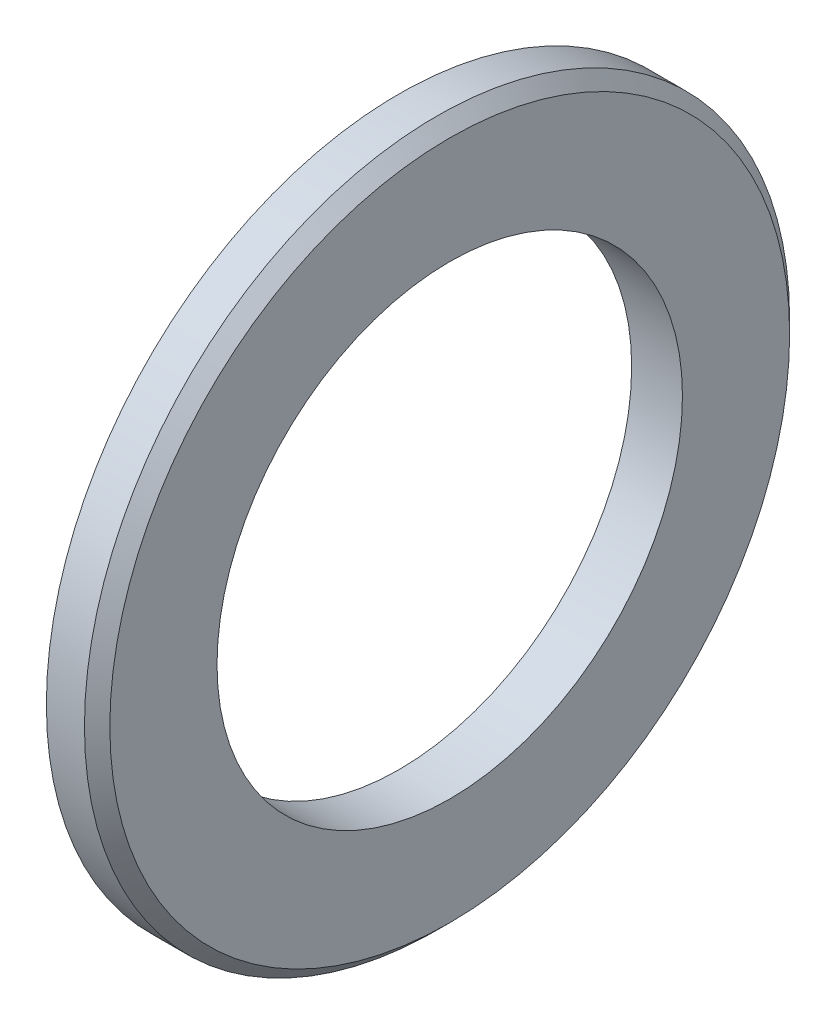
ISO-10303-21;
HEADER;
FILE_DESCRIPTION(('STEP AP214'),'2;1');
FILE_NAME('part.step','',(''),(''),'','','');
FILE_SCHEMA(('AUTOMOTIVE_DESIGN { 1 0 10303 214 1 1 1 1 }'));
ENDSEC;
DATA;
#1=APPLICATION_CONTEXT('core data for automotive mechanical design processes');
#2=APPLICATION_PROTOCOL_DEFINITION('international standard','automotive_design',2000,#1);
#3=PRODUCT_CONTEXT('',#1,'mechanical');
#4=PRODUCT('Part','Part','',(#3));
#5=PRODUCT_RELATED_PRODUCT_CATEGORY('part','',(#4));
#6=PRODUCT_DEFINITION_FORMATION('','',#4);
#7=PRODUCT_DEFINITION_CONTEXT('part definition',#1,'design');
#8=PRODUCT_DEFINITION('design','',#6,#7);
#9=PRODUCT_DEFINITION_SHAPE('','',#8);
#10=(LENGTH_UNIT() NAMED_UNIT(*) SI_UNIT(.MILLI.,.METRE.));
#11=(NAMED_UNIT(*) PLANE_ANGLE_UNIT() SI_UNIT($,.RADIAN.));
#12=(NAMED_UNIT(*) SI_UNIT($,.STERADIAN.) SOLID_ANGLE_UNIT());
#13=UNCERTAINTY_MEASURE_WITH_UNIT(LENGTH_MEASURE(1.E-05),#10,'distance_accuracy_value','');
#14=(GEOMETRIC_REPRESENTATION_CONTEXT(3) GLOBAL_UNCERTAINTY_ASSIGNED_CONTEXT((#13)) GLOBAL_UNIT_ASSIGNED_CONTEXT((#10,
#11,#12)) REPRESENTATION_CONTEXT('',''));
#15=CARTESIAN_POINT('',(0.,0.,0.));
#16=DIRECTION('',(0.,0.,1.));
#17=DIRECTION('',(1.,0.,0.));
#18=AXIS2_PLACEMENT_3D('',#15,#16,#17);
#19=CARTESIAN_POINT('',(-34.9249999999999,0.,0.));
#20=DIRECTION('',(-1.,0.,0.));
#21=DIRECTION('',(0.,0.,1.));
#22=AXIS2_PLACEMENT_3D('',#19,#20,#21);
#23=CYLINDRICAL_SURFACE('',#22,82.5);
#24=CARTESIAN_POINT('',(0.,0.,0.));
#25=DIRECTION('',(-1.,0.,0.));
#26=DIRECTION('',(0.,0.,1.));
#27=AXIS2_PLACEMENT_3D('',#24,#25,#26);
#28=CIRCLE('',#27,82.5);
#29=CARTESIAN_POINT('',(0.,0.,82.5));
#30=VERTEX_POINT('',#29);
#31=EDGE_CURVE('E41',#30,#30,#28,.T.);
#32=ORIENTED_EDGE('',*,*,#31,.F.);
#33=EDGE_LOOP('',(#32));
#34=FACE_BOUND('',#33,.T.);
#35=CARTESIAN_POINT('',(-18.,0.,0.));
#36=DIRECTION('',(-1.,0.,0.));
#37=DIRECTION('',(0.,0.,1.));
#38=AXIS2_PLACEMENT_3D('',#35,#36,#37);
#39=CIRCLE('',#38,82.5);
#40=CARTESIAN_POINT('',(-18.,0.,82.5));
#41=VERTEX_POINT('',#40);
#42=EDGE_CURVE('E50',#41,#41,#39,.T.);
#43=ORIENTED_EDGE('',*,*,#42,.T.);
#44=EDGE_LOOP('',(#43));
#45=FACE_BOUND('',#44,.T.);
#46=ADVANCED_FACE('F30',(#34,#45),#23,.F.);
#47=CARTESIAN_POINT('',(0.,82.5,0.));
#48=DIRECTION('',(-1.,0.,0.));
#49=DIRECTION('',(0.,0.,1.));
#50=AXIS2_PLACEMENT_3D('',#47,#48,#49);
#51=PLANE('',#50);
#52=CARTESIAN_POINT('',(0.,0.,0.));
#53=DIRECTION('',(-1.,0.,0.));
#54=DIRECTION('',(0.,0.,1.));
#55=AXIS2_PLACEMENT_3D('',#52,#53,#54);
#56=CIRCLE('',#55,120.5);
#57=CARTESIAN_POINT('',(0.,0.,120.5));
#58=VERTEX_POINT('',#57);
#59=EDGE_CURVE('E10',#58,#58,#56,.F.);
#60=ORIENTED_EDGE('',*,*,#59,.T.);
#61=EDGE_LOOP('',(#60));
#62=FACE_BOUND('',#61,.T.);
#63=ORIENTED_EDGE('',*,*,#31,.T.);
#64=EDGE_LOOP('',(#63));
#65=FACE_BOUND('',#64,.T.);
#66=ADVANCED_FACE('F63',(#62,#65),#51,.F.);
#67=CARTESIAN_POINT('',(-34.9249999999999,0.,0.));
#68=DIRECTION('',(-1.,0.,0.));
#69=DIRECTION('',(0.,0.,1.));
#70=AXIS2_PLACEMENT_3D('',#67,#68,#69);
#71=CYLINDRICAL_SURFACE('',#70,125.);
#72=CARTESIAN_POINT('',(-4.49999999999999,0.,0.));
#73=DIRECTION('',(-1.,0.,0.));
#74=DIRECTION('',(0.,0.,1.));
#75=AXIS2_PLACEMENT_3D('',#72,#73,#74);
#76=CIRCLE('',#75,125.);
#77=CARTESIAN_POINT('',(-4.49999999999999,0.,125.));
#78=VERTEX_POINT('',#77);
#79=EDGE_CURVE('E37',#78,#78,#76,.T.);
#80=ORIENTED_EDGE('',*,*,#79,.T.);
#81=EDGE_LOOP('',(#80));
#82=FACE_BOUND('',#81,.T.);
#83=CARTESIAN_POINT('',(-18.,0.,0.));
#84=DIRECTION('',(-1.,0.,0.));
#85=DIRECTION('',(0.,0.,1.));
#86=AXIS2_PLACEMENT_3D('',#83,#84,#85);
#87=CIRCLE('',#86,125.);
#88=CARTESIAN_POINT('',(-18.,0.,125.));
#89=VERTEX_POINT('',#88);
#90=EDGE_CURVE('E45',#89,#89,#87,.T.);
#91=ORIENTED_EDGE('',*,*,#90,.F.);
#92=EDGE_LOOP('',(#91));
#93=FACE_BOUND('',#92,.T.);
#94=ADVANCED_FACE('F58',(#82,#93),#71,.T.);
#95=CARTESIAN_POINT('',(-18.,125.,0.));
#96=DIRECTION('',(1.,0.,0.));
#97=DIRECTION('',(0.,0.,-1.));
#98=AXIS2_PLACEMENT_3D('',#95,#96,#97);
#99=PLANE('',#98);
#100=ORIENTED_EDGE('',*,*,#42,.F.);
#101=EDGE_LOOP('',(#100));
#102=FACE_BOUND('',#101,.T.);
#103=ORIENTED_EDGE('',*,*,#90,.T.);
#104=EDGE_LOOP('',(#103));
#105=FACE_BOUND('',#104,.T.);
#106=ADVANCED_FACE('F55',(#102,#105),#99,.F.);
#107=CARTESIAN_POINT('',(-4.49999999999999,0.,0.));
#108=DIRECTION('',(-1.,0.,0.));
#109=DIRECTION('',(0.,0.,1.));
#110=AXIS2_PLACEMENT_3D('',#107,#108,#109);
#111=CONICAL_SURFACE('',#110,125.,0.78539816339745);
#112=ORIENTED_EDGE('',*,*,#59,.F.);
#113=EDGE_LOOP('',(#112));
#114=FACE_BOUND('',#113,.T.);
#115=ORIENTED_EDGE('',*,*,#79,.F.);
#116=EDGE_LOOP('',(#115));
#117=FACE_BOUND('',#116,.T.);
#118=ADVANCED_FACE('F32',(#114,#117),#111,.T.);
#119=CLOSED_SHELL('',(#46,#66,#94,#106,#118));
#120=MANIFOLD_SOLID_BREP('B2',#119);
#121=ADVANCED_BREP_SHAPE_REPRESENTATION('',(#18,#120),#14);
#122=SHAPE_DEFINITION_REPRESENTATION(#9,#121);
ENDSEC;
END-ISO-10303-21;
